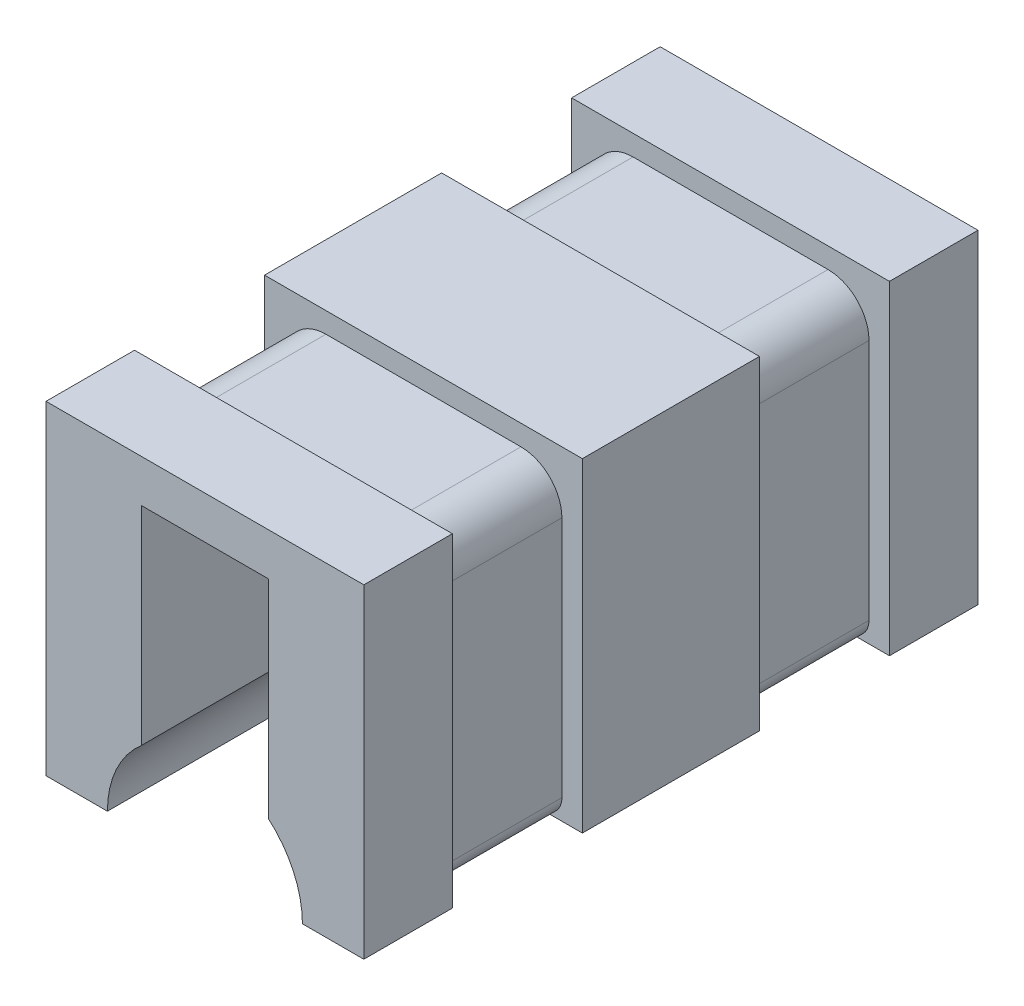
ISO-10303-21;
HEADER;
FILE_DESCRIPTION(('STEP AP214'),'2;1');
FILE_NAME('part.step','',(''),(''),'','','');
FILE_SCHEMA(('AUTOMOTIVE_DESIGN { 1 0 10303 214 1 1 1 1 }'));
ENDSEC;
DATA;
#1=APPLICATION_CONTEXT('core data for automotive mechanical design processes');
#2=APPLICATION_PROTOCOL_DEFINITION('international standard','automotive_design',2000,#1);
#3=PRODUCT_CONTEXT('',#1,'mechanical');
#4=PRODUCT('Part','Part','',(#3));
#5=PRODUCT_RELATED_PRODUCT_CATEGORY('part','',(#4));
#6=PRODUCT_DEFINITION_FORMATION('','',#4);
#7=PRODUCT_DEFINITION_CONTEXT('part definition',#1,'design');
#8=PRODUCT_DEFINITION('design','',#6,#7);
#9=PRODUCT_DEFINITION_SHAPE('','',#8);
#10=(LENGTH_UNIT() NAMED_UNIT(*) SI_UNIT(.MILLI.,.METRE.));
#11=(NAMED_UNIT(*) PLANE_ANGLE_UNIT() SI_UNIT($,.RADIAN.));
#12=(NAMED_UNIT(*) SI_UNIT($,.STERADIAN.) SOLID_ANGLE_UNIT());
#13=UNCERTAINTY_MEASURE_WITH_UNIT(LENGTH_MEASURE(1.E-05),#10,'distance_accuracy_value','');
#14=(GEOMETRIC_REPRESENTATION_CONTEXT(3) GLOBAL_UNCERTAINTY_ASSIGNED_CONTEXT((#13)) GLOBAL_UNIT_ASSIGNED_CONTEXT((#10,
#11,#12)) REPRESENTATION_CONTEXT('',''));
#15=CARTESIAN_POINT('',(0.,0.,0.));
#16=DIRECTION('',(0.,0.,1.));
#17=DIRECTION('',(1.,0.,0.));
#18=AXIS2_PLACEMENT_3D('',#15,#16,#17);
#19=CARTESIAN_POINT('',(-7.7625,15.8405273700718,15.));
#20=DIRECTION('',(0.,-1.,0.));
#21=DIRECTION('',(0.,0.,-1.));
#22=AXIS2_PLACEMENT_3D('',#19,#20,#21);
#23=PLANE('',#22);
#24=DIRECTION('',(0.,0.,-1.));
#25=VECTOR('',#24,1.);
#26=CARTESIAN_POINT('',(7.7625,15.8405273700718,15.));
#27=LINE('',#26,#25);
#28=CARTESIAN_POINT('',(7.7625,15.8405273700718,4.325));
#29=VERTEX_POINT('',#28);
#30=CARTESIAN_POINT('',(7.7625,15.8405273700718,-4.325));
#31=VERTEX_POINT('',#30);
#32=EDGE_CURVE('E271',#29,#31,#27,.T.);
#33=ORIENTED_EDGE('',*,*,#32,.T.);
#34=DIRECTION('',(-1.,0.,0.));
#35=VECTOR('',#34,1.);
#36=CARTESIAN_POINT('',(0.,15.8405273700718,-4.325));
#37=LINE('',#36,#35);
#38=CARTESIAN_POINT('',(-7.7625,15.8405273700718,-4.325));
#39=VERTEX_POINT('',#38);
#40=EDGE_CURVE('E252',#31,#39,#37,.T.);
#41=ORIENTED_EDGE('',*,*,#40,.T.);
#42=DIRECTION('',(0.,0.,-1.));
#43=VECTOR('',#42,1.);
#44=CARTESIAN_POINT('',(-7.7625,15.8405273700718,15.));
#45=LINE('',#44,#43);
#46=CARTESIAN_POINT('',(-7.7625,15.8405273700718,4.325));
#47=VERTEX_POINT('',#46);
#48=EDGE_CURVE('E461',#47,#39,#45,.T.);
#49=ORIENTED_EDGE('',*,*,#48,.F.);
#50=DIRECTION('',(-1.,0.,0.));
#51=VECTOR('',#50,1.);
#52=CARTESIAN_POINT('',(0.,15.8405273700718,4.325));
#53=LINE('',#52,#51);
#54=EDGE_CURVE('E277',#29,#47,#53,.T.);
#55=ORIENTED_EDGE('',*,*,#54,.F.);
#56=EDGE_LOOP('',(#33,#41,#49,#55));
#57=FACE_BOUND('',#56,.T.);
#58=ADVANCED_FACE('F33',(#57),#23,.F.);
#59=CARTESIAN_POINT('',(4.7625,0.,15.));
#60=DIRECTION('',(0.,1.,0.));
#61=DIRECTION('',(0.,0.,1.));
#62=AXIS2_PLACEMENT_3D('',#59,#60,#61);
#63=PLANE('',#62);
#64=DIRECTION('',(-1.,0.,0.));
#65=VECTOR('',#64,1.);
#66=CARTESIAN_POINT('',(7.7625,0.,-10.675));
#67=LINE('',#66,#65);
#68=CARTESIAN_POINT('',(7.7625,0.,-10.675));
#69=VERTEX_POINT('',#68);
#70=CARTESIAN_POINT('',(5.7625,0.,-10.675));
#71=VERTEX_POINT('',#70);
#72=EDGE_CURVE('E533',#69,#71,#67,.T.);
#73=ORIENTED_EDGE('',*,*,#72,.T.);
#74=DIRECTION('',(0.,0.,-1.));
#75=VECTOR('',#74,1.);
#76=CARTESIAN_POINT('',(5.7625,0.,15.));
#77=LINE('',#76,#75);
#78=CARTESIAN_POINT('',(5.7625,0.,-4.325));
#79=VERTEX_POINT('',#78);
#80=EDGE_CURVE('E362',#71,#79,#77,.F.);
#81=ORIENTED_EDGE('',*,*,#80,.T.);
#82=DIRECTION('',(-1.,0.,0.));
#83=VECTOR('',#82,1.);
#84=CARTESIAN_POINT('',(7.7625,0.,-4.325));
#85=LINE('',#84,#83);
#86=CARTESIAN_POINT('',(7.7625,0.,-4.325));
#87=VERTEX_POINT('',#86);
#88=EDGE_CURVE('E274',#87,#79,#85,.T.);
#89=ORIENTED_EDGE('',*,*,#88,.F.);
#90=DIRECTION('',(0.,0.,-1.));
#91=VECTOR('',#90,1.);
#92=CARTESIAN_POINT('',(7.7625,0.,15.));
#93=LINE('',#92,#91);
#94=CARTESIAN_POINT('',(7.7625,0.,4.325));
#95=VERTEX_POINT('',#94);
#96=EDGE_CURVE('E273',#95,#87,#93,.T.);
#97=ORIENTED_EDGE('',*,*,#96,.F.);
#98=DIRECTION('',(-1.,0.,0.));
#99=VECTOR('',#98,1.);
#100=CARTESIAN_POINT('',(7.7625,0.,4.325));
#101=LINE('',#100,#99);
#102=CARTESIAN_POINT('',(5.7625,0.,4.325));
#103=VERTEX_POINT('',#102);
#104=EDGE_CURVE('E495',#95,#103,#101,.T.);
#105=ORIENTED_EDGE('',*,*,#104,.T.);
#106=DIRECTION('',(0.,0.,1.));
#107=VECTOR('',#106,1.);
#108=CARTESIAN_POINT('',(5.7625,0.,10.675));
#109=LINE('',#108,#107);
#110=CARTESIAN_POINT('',(5.7625,0.,10.675));
#111=VERTEX_POINT('',#110);
#112=EDGE_CURVE('E359',#103,#111,#109,.T.);
#113=ORIENTED_EDGE('',*,*,#112,.T.);
#114=DIRECTION('',(-1.,0.,0.));
#115=VECTOR('',#114,1.);
#116=CARTESIAN_POINT('',(7.7625,0.,10.675));
#117=LINE('',#116,#115);
#118=CARTESIAN_POINT('',(7.7625,0.,10.675));
#119=VERTEX_POINT('',#118);
#120=EDGE_CURVE('E509',#119,#111,#117,.T.);
#121=ORIENTED_EDGE('',*,*,#120,.F.);
#122=CARTESIAN_POINT('',(7.7625,0.,15.));
#123=VERTEX_POINT('',#122);
#124=EDGE_CURVE('E288',#123,#119,#93,.T.);
#125=ORIENTED_EDGE('',*,*,#124,.F.);
#126=DIRECTION('',(1.,0.,0.));
#127=VECTOR('',#126,1.);
#128=CARTESIAN_POINT('',(4.7625,0.,15.));
#129=LINE('',#128,#127);
#130=CARTESIAN_POINT('',(4.7625,0.,15.));
#131=VERTEX_POINT('',#130);
#132=EDGE_CURVE('E421',#131,#123,#129,.T.);
#133=ORIENTED_EDGE('',*,*,#132,.F.);
#134=DIRECTION('',(0.,0.,-1.));
#135=VECTOR('',#134,1.);
#136=CARTESIAN_POINT('',(4.7625,0.,15.));
#137=LINE('',#136,#135);
#138=CARTESIAN_POINT('',(4.7625,0.,-15.));
#139=VERTEX_POINT('',#138);
#140=EDGE_CURVE('E291',#131,#139,#137,.T.);
#141=ORIENTED_EDGE('',*,*,#140,.T.);
#142=DIRECTION('',(1.,0.,0.));
#143=VECTOR('',#142,1.);
#144=CARTESIAN_POINT('',(4.7625,0.,-15.));
#145=LINE('',#144,#143);
#146=CARTESIAN_POINT('',(7.7625,0.,-15.));
#147=VERTEX_POINT('',#146);
#148=EDGE_CURVE('E444',#139,#147,#145,.T.);
#149=ORIENTED_EDGE('',*,*,#148,.T.);
#150=EDGE_CURVE('E283',#69,#147,#93,.T.);
#151=ORIENTED_EDGE('',*,*,#150,.F.);
#152=EDGE_LOOP('',(#73,#81,#89,#97,#105,#113,#121,#125,#133,#141,#149,#151));
#153=FACE_BOUND('',#152,.T.);
#154=ADVANCED_FACE('F543',(#153),#63,.F.);
#155=CARTESIAN_POINT('',(7.7625,0.,15.));
#156=DIRECTION('',(-1.,0.,0.));
#157=DIRECTION('',(0.,-1.,0.));
#158=AXIS2_PLACEMENT_3D('',#155,#156,#157);
#159=PLANE('',#158);
#160=DIRECTION('',(0.,-1.,0.));
#161=VECTOR('',#160,1.);
#162=CARTESIAN_POINT('',(7.7625,15.8405273700718,-4.325));
#163=LINE('',#162,#161);
#164=EDGE_CURVE('E255',#31,#87,#163,.T.);
#165=ORIENTED_EDGE('',*,*,#164,.F.);
#166=ORIENTED_EDGE('',*,*,#32,.F.);
#167=DIRECTION('',(0.,-1.,0.));
#168=VECTOR('',#167,1.);
#169=CARTESIAN_POINT('',(7.7625,15.8405273700718,4.325));
#170=LINE('',#169,#168);
#171=EDGE_CURVE('E494',#29,#95,#170,.T.);
#172=ORIENTED_EDGE('',*,*,#171,.T.);
#173=ORIENTED_EDGE('',*,*,#96,.T.);
#174=EDGE_LOOP('',(#165,#166,#172,#173));
#175=FACE_BOUND('',#174,.T.);
#176=ADVANCED_FACE('F269',(#175),#159,.F.);
#177=DIRECTION('',(-1.,0.,0.));
#178=VECTOR('',#177,1.);
#179=CARTESIAN_POINT('',(0.,15.8405273700718,-10.675));
#180=LINE('',#179,#178);
#181=CARTESIAN_POINT('',(7.7625,15.8405273700718,-10.675));
#182=VERTEX_POINT('',#181);
#183=CARTESIAN_POINT('',(-7.7625,15.8405273700718,-10.675));
#184=VERTEX_POINT('',#183);
#185=EDGE_CURVE('E522',#182,#184,#180,.T.);
#186=ORIENTED_EDGE('',*,*,#185,.F.);
#187=CARTESIAN_POINT('',(7.7625,15.8405273700718,-15.));
#188=VERTEX_POINT('',#187);
#189=EDGE_CURVE('E280',#182,#188,#27,.T.);
#190=ORIENTED_EDGE('',*,*,#189,.T.);
#191=DIRECTION('',(-1.,0.,0.));
#192=VECTOR('',#191,1.);
#193=CARTESIAN_POINT('',(-7.7625,15.8405273700718,-15.));
#194=LINE('',#193,#192);
#195=CARTESIAN_POINT('',(-7.7625,15.8405273700718,-15.));
#196=VERTEX_POINT('',#195);
#197=EDGE_CURVE('E450',#188,#196,#194,.T.);
#198=ORIENTED_EDGE('',*,*,#197,.T.);
#199=EDGE_CURVE('E459',#184,#196,#45,.T.);
#200=ORIENTED_EDGE('',*,*,#199,.F.);
#201=EDGE_LOOP('',(#186,#190,#198,#200));
#202=FACE_BOUND('',#201,.T.);
#203=ADVANCED_FACE('F590',(#202),#23,.F.);
#204=CARTESIAN_POINT('',(-7.7625,15.8405273700718,15.));
#205=DIRECTION('',(1.,0.,0.));
#206=DIRECTION('',(0.,1.,0.));
#207=AXIS2_PLACEMENT_3D('',#204,#205,#206);
#208=PLANE('',#207);
#209=DIRECTION('',(0.,-1.,0.));
#210=VECTOR('',#209,1.);
#211=CARTESIAN_POINT('',(-7.7625,15.8405273700718,-4.325));
#212=LINE('',#211,#210);
#213=CARTESIAN_POINT('',(-7.7625,0.,-4.325));
#214=VERTEX_POINT('',#213);
#215=EDGE_CURVE('E258',#39,#214,#212,.T.);
#216=ORIENTED_EDGE('',*,*,#215,.T.);
#217=DIRECTION('',(0.,0.,-1.));
#218=VECTOR('',#217,1.);
#219=CARTESIAN_POINT('',(-7.7625,0.,15.));
#220=LINE('',#219,#218);
#221=CARTESIAN_POINT('',(-7.7625,0.,4.325));
#222=VERTEX_POINT('',#221);
#223=EDGE_CURVE('E460',#222,#214,#220,.T.);
#224=ORIENTED_EDGE('',*,*,#223,.F.);
#225=DIRECTION('',(0.,-1.,0.));
#226=VECTOR('',#225,1.);
#227=CARTESIAN_POINT('',(-7.7625,15.8405273700718,4.325));
#228=LINE('',#227,#226);
#229=EDGE_CURVE('E503',#47,#222,#228,.T.);
#230=ORIENTED_EDGE('',*,*,#229,.F.);
#231=ORIENTED_EDGE('',*,*,#48,.T.);
#232=EDGE_LOOP('',(#216,#224,#230,#231));
#233=FACE_BOUND('',#232,.T.);
#234=ADVANCED_FACE('F577',(#233),#208,.F.);
#235=CARTESIAN_POINT('',(-7.7625,0.,15.));
#236=DIRECTION('',(0.,1.,0.));
#237=DIRECTION('',(0.,0.,1.));
#238=AXIS2_PLACEMENT_3D('',#235,#236,#237);
#239=PLANE('',#238);
#240=DIRECTION('',(0.,0.,-1.));
#241=VECTOR('',#240,1.);
#242=CARTESIAN_POINT('',(-5.7625,0.,-10.675));
#243=LINE('',#242,#241);
#244=CARTESIAN_POINT('',(-5.7625,0.,-4.325));
#245=VERTEX_POINT('',#244);
#246=CARTESIAN_POINT('',(-5.7625,0.,-10.675));
#247=VERTEX_POINT('',#246);
#248=EDGE_CURVE('E351',#245,#247,#243,.T.);
#249=ORIENTED_EDGE('',*,*,#248,.T.);
#250=DIRECTION('',(1.,0.,0.));
#251=VECTOR('',#250,1.);
#252=CARTESIAN_POINT('',(-7.7625,0.,-10.675));
#253=LINE('',#252,#251);
#254=CARTESIAN_POINT('',(-7.7625,0.,-10.675));
#255=VERTEX_POINT('',#254);
#256=EDGE_CURVE('E466',#255,#247,#253,.T.);
#257=ORIENTED_EDGE('',*,*,#256,.F.);
#258=CARTESIAN_POINT('',(-7.7625,0.,-15.));
#259=VERTEX_POINT('',#258);
#260=EDGE_CURVE('E458',#255,#259,#220,.T.);
#261=ORIENTED_EDGE('',*,*,#260,.T.);
#262=DIRECTION('',(1.,0.,0.));
#263=VECTOR('',#262,1.);
#264=CARTESIAN_POINT('',(-7.7625,0.,-15.));
#265=LINE('',#264,#263);
#266=CARTESIAN_POINT('',(-4.7625,0.,-15.));
#267=VERTEX_POINT('',#266);
#268=EDGE_CURVE('E413',#259,#267,#265,.T.);
#269=ORIENTED_EDGE('',*,*,#268,.T.);
#270=DIRECTION('',(0.,0.,-1.));
#271=VECTOR('',#270,1.);
#272=CARTESIAN_POINT('',(-4.7625,0.,15.));
#273=LINE('',#272,#271);
#274=CARTESIAN_POINT('',(-4.7625,0.,15.));
#275=VERTEX_POINT('',#274);
#276=EDGE_CURVE('E431',#275,#267,#273,.T.);
#277=ORIENTED_EDGE('',*,*,#276,.F.);
#278=DIRECTION('',(1.,0.,0.));
#279=VECTOR('',#278,1.);
#280=CARTESIAN_POINT('',(-7.7625,0.,15.));
#281=LINE('',#280,#279);
#282=CARTESIAN_POINT('',(-7.7625,0.,15.));
#283=VERTEX_POINT('',#282);
#284=EDGE_CURVE('E429',#283,#275,#281,.T.);
#285=ORIENTED_EDGE('',*,*,#284,.F.);
#286=CARTESIAN_POINT('',(-7.7625,0.,10.675));
#287=VERTEX_POINT('',#286);
#288=EDGE_CURVE('E398',#283,#287,#220,.T.);
#289=ORIENTED_EDGE('',*,*,#288,.T.);
#290=DIRECTION('',(1.,0.,0.));
#291=VECTOR('',#290,1.);
#292=CARTESIAN_POINT('',(-7.7625,0.,10.675));
#293=LINE('',#292,#291);
#294=CARTESIAN_POINT('',(-5.7625,0.,10.675));
#295=VERTEX_POINT('',#294);
#296=EDGE_CURVE('E386',#287,#295,#293,.T.);
#297=ORIENTED_EDGE('',*,*,#296,.T.);
#298=DIRECTION('',(0.,0.,1.));
#299=VECTOR('',#298,1.);
#300=CARTESIAN_POINT('',(-5.7625,0.,15.));
#301=LINE('',#300,#299);
#302=CARTESIAN_POINT('',(-5.7625,0.,4.325));
#303=VERTEX_POINT('',#302);
#304=EDGE_CURVE('E348',#295,#303,#301,.F.);
#305=ORIENTED_EDGE('',*,*,#304,.T.);
#306=DIRECTION('',(1.,0.,0.));
#307=VECTOR('',#306,1.);
#308=CARTESIAN_POINT('',(-7.7625,0.,4.325));
#309=LINE('',#308,#307);
#310=EDGE_CURVE('E393',#222,#303,#309,.T.);
#311=ORIENTED_EDGE('',*,*,#310,.F.);
#312=ORIENTED_EDGE('',*,*,#223,.T.);
#313=DIRECTION('',(1.,0.,0.));
#314=VECTOR('',#313,1.);
#315=CARTESIAN_POINT('',(-7.7625,0.,-4.325));
#316=LINE('',#315,#314);
#317=EDGE_CURVE('E526',#214,#245,#316,.T.);
#318=ORIENTED_EDGE('',*,*,#317,.T.);
#319=EDGE_LOOP('',(#249,#257,#261,#269,#277,#285,#289,#297,#305,#311,#312,#318));
#320=FACE_BOUND('',#319,.T.);
#321=ADVANCED_FACE('F391',(#320),#239,.F.);
#322=ORIENTED_EDGE('',*,*,#189,.F.);
#323=DIRECTION('',(0.,-1.,0.));
#324=VECTOR('',#323,1.);
#325=CARTESIAN_POINT('',(7.7625,15.8405273700718,-10.675));
#326=LINE('',#325,#324);
#327=EDGE_CURVE('E535',#182,#69,#326,.T.);
#328=ORIENTED_EDGE('',*,*,#327,.T.);
#329=ORIENTED_EDGE('',*,*,#150,.T.);
#330=DIRECTION('',(0.,1.,0.));
#331=VECTOR('',#330,1.);
#332=CARTESIAN_POINT('',(7.7625,0.,-15.));
#333=LINE('',#332,#331);
#334=EDGE_CURVE('E447',#147,#188,#333,.T.);
#335=ORIENTED_EDGE('',*,*,#334,.T.);
#336=EDGE_LOOP('',(#322,#328,#329,#335));
#337=FACE_BOUND('',#336,.T.);
#338=ADVANCED_FACE('F582',(#337),#159,.F.);
#339=CARTESIAN_POINT('',(7.7625,15.8405273700718,15.));
#340=VERTEX_POINT('',#339);
#341=CARTESIAN_POINT('',(7.7625,15.8405273700718,10.675));
#342=VERTEX_POINT('',#341);
#343=EDGE_CURVE('E279',#340,#342,#27,.T.);
#344=ORIENTED_EDGE('',*,*,#343,.T.);
#345=DIRECTION('',(-1.,0.,0.));
#346=VECTOR('',#345,1.);
#347=CARTESIAN_POINT('',(0.,15.8405273700718,10.675));
#348=LINE('',#347,#346);
#349=CARTESIAN_POINT('',(-7.7625,15.8405273700718,10.675));
#350=VERTEX_POINT('',#349);
#351=EDGE_CURVE('E403',#342,#350,#348,.T.);
#352=ORIENTED_EDGE('',*,*,#351,.T.);
#353=CARTESIAN_POINT('',(-7.7625,15.8405273700718,15.));
#354=VERTEX_POINT('',#353);
#355=EDGE_CURVE('E284',#354,#350,#45,.T.);
#356=ORIENTED_EDGE('',*,*,#355,.F.);
#357=DIRECTION('',(-1.,0.,0.));
#358=VECTOR('',#357,1.);
#359=CARTESIAN_POINT('',(-7.7625,15.8405273700718,15.));
#360=LINE('',#359,#358);
#361=EDGE_CURVE('E425',#340,#354,#360,.T.);
#362=ORIENTED_EDGE('',*,*,#361,.F.);
#363=EDGE_LOOP('',(#344,#352,#356,#362));
#364=FACE_BOUND('',#363,.T.);
#365=ADVANCED_FACE('F492',(#364),#23,.F.);
#366=ORIENTED_EDGE('',*,*,#260,.F.);
#367=DIRECTION('',(0.,-1.,0.));
#368=VECTOR('',#367,1.);
#369=CARTESIAN_POINT('',(-7.7625,15.8405273700718,-10.675));
#370=LINE('',#369,#368);
#371=EDGE_CURVE('E264',#184,#255,#370,.T.);
#372=ORIENTED_EDGE('',*,*,#371,.F.);
#373=ORIENTED_EDGE('',*,*,#199,.T.);
#374=DIRECTION('',(0.,-1.,0.));
#375=VECTOR('',#374,1.);
#376=CARTESIAN_POINT('',(-7.7625,15.8405273700718,-15.));
#377=LINE('',#376,#375);
#378=EDGE_CURVE('E453',#196,#259,#377,.T.);
#379=ORIENTED_EDGE('',*,*,#378,.T.);
#380=EDGE_LOOP('',(#366,#372,#373,#379));
#381=FACE_BOUND('',#380,.T.);
#382=ADVANCED_FACE('F470',(#381),#208,.F.);
#383=CARTESIAN_POINT('',(0.,0.,15.));
#384=DIRECTION('',(0.,0.,-1.));
#385=DIRECTION('',(-1.,0.,0.));
#386=AXIS2_PLACEMENT_3D('',#383,#384,#385);
#387=CYLINDRICAL_SURFACE('',#386,4.7625);
#388=CARTESIAN_POINT('',(0.,0.,-15.));
#389=DIRECTION('',(0.,0.,-1.));
#390=DIRECTION('',(1.,0.,0.));
#391=AXIS2_PLACEMENT_3D('',#388,#389,#390);
#392=CIRCLE('',#391,4.7625);
#393=CARTESIAN_POINT('',(-3.1,3.61543998014073,-15.));
#394=VERTEX_POINT('',#393);
#395=EDGE_CURVE('E432',#267,#394,#392,.T.);
#396=ORIENTED_EDGE('',*,*,#395,.T.);
#397=DIRECTION('',(0.,0.,-1.));
#398=VECTOR('',#397,1.);
#399=CARTESIAN_POINT('',(-3.1,3.61543998014073,15.));
#400=LINE('',#399,#398);
#401=CARTESIAN_POINT('',(-3.1,3.61543998014073,15.));
#402=VERTEX_POINT('',#401);
#403=EDGE_CURVE('E303',#402,#394,#400,.T.);
#404=ORIENTED_EDGE('',*,*,#403,.F.);
#405=CARTESIAN_POINT('',(0.,0.,15.));
#406=DIRECTION('',(0.,0.,-1.));
#407=DIRECTION('',(1.,0.,0.));
#408=AXIS2_PLACEMENT_3D('',#405,#406,#407);
#409=CIRCLE('',#408,4.7625);
#410=EDGE_CURVE('E409',#275,#402,#409,.T.);
#411=ORIENTED_EDGE('',*,*,#410,.F.);
#412=ORIENTED_EDGE('',*,*,#276,.T.);
#413=EDGE_LOOP('',(#396,#404,#411,#412));
#414=FACE_BOUND('',#413,.T.);
#415=ADVANCED_FACE('F479',(#414),#387,.F.);
#416=CARTESIAN_POINT('',(-3.1,3.61543998014073,15.));
#417=DIRECTION('',(-1.,0.,0.));
#418=DIRECTION('',(0.,-1.,0.));
#419=AXIS2_PLACEMENT_3D('',#416,#417,#418);
#420=PLANE('',#419);
#421=DIRECTION('',(0.,1.,0.));
#422=VECTOR('',#421,1.);
#423=CARTESIAN_POINT('',(-3.1,3.61543998014073,-15.));
#424=LINE('',#423,#422);
#425=CARTESIAN_POINT('',(-3.1,13.7625,-15.));
#426=VERTEX_POINT('',#425);
#427=EDGE_CURVE('E435',#394,#426,#424,.T.);
#428=ORIENTED_EDGE('',*,*,#427,.T.);
#429=DIRECTION('',(0.,0.,-1.));
#430=VECTOR('',#429,1.);
#431=CARTESIAN_POINT('',(-3.1,13.7625,15.));
#432=LINE('',#431,#430);
#433=CARTESIAN_POINT('',(-3.1,13.7625,15.));
#434=VERTEX_POINT('',#433);
#435=EDGE_CURVE('E300',#434,#426,#432,.T.);
#436=ORIENTED_EDGE('',*,*,#435,.F.);
#437=DIRECTION('',(0.,1.,0.));
#438=VECTOR('',#437,1.);
#439=CARTESIAN_POINT('',(-3.1,3.61543998014073,15.));
#440=LINE('',#439,#438);
#441=EDGE_CURVE('E412',#402,#434,#440,.T.);
#442=ORIENTED_EDGE('',*,*,#441,.F.);
#443=ORIENTED_EDGE('',*,*,#403,.T.);
#444=EDGE_LOOP('',(#428,#436,#442,#443));
#445=FACE_BOUND('',#444,.T.);
#446=ADVANCED_FACE('F770',(#445),#420,.F.);
#447=CARTESIAN_POINT('',(-3.1,13.7625,15.));
#448=DIRECTION('',(0.,1.,0.));
#449=DIRECTION('',(0.,0.,1.));
#450=AXIS2_PLACEMENT_3D('',#447,#448,#449);
#451=PLANE('',#450);
#452=DIRECTION('',(1.,0.,0.));
#453=VECTOR('',#452,1.);
#454=CARTESIAN_POINT('',(-3.1,13.7625,-15.));
#455=LINE('',#454,#453);
#456=CARTESIAN_POINT('',(3.1,13.7625,-15.));
#457=VERTEX_POINT('',#456);
#458=EDGE_CURVE('E438',#426,#457,#455,.T.);
#459=ORIENTED_EDGE('',*,*,#458,.T.);
#460=DIRECTION('',(0.,0.,-1.));
#461=VECTOR('',#460,1.);
#462=CARTESIAN_POINT('',(3.1,13.7625,15.));
#463=LINE('',#462,#461);
#464=CARTESIAN_POINT('',(3.1,13.7625,15.));
#465=VERTEX_POINT('',#464);
#466=EDGE_CURVE('E297',#465,#457,#463,.T.);
#467=ORIENTED_EDGE('',*,*,#466,.F.);
#468=DIRECTION('',(1.,0.,0.));
#469=VECTOR('',#468,1.);
#470=CARTESIAN_POINT('',(-3.1,13.7625,15.));
#471=LINE('',#470,#469);
#472=EDGE_CURVE('E415',#434,#465,#471,.T.);
#473=ORIENTED_EDGE('',*,*,#472,.F.);
#474=ORIENTED_EDGE('',*,*,#435,.T.);
#475=EDGE_LOOP('',(#459,#467,#473,#474));
#476=FACE_BOUND('',#475,.T.);
#477=ADVANCED_FACE('F773',(#476),#451,.F.);
#478=CARTESIAN_POINT('',(3.1,3.61543998014073,15.));
#479=DIRECTION('',(1.,0.,0.));
#480=DIRECTION('',(0.,1.,0.));
#481=AXIS2_PLACEMENT_3D('',#478,#479,#480);
#482=PLANE('',#481);
#483=DIRECTION('',(0.,-1.,0.));
#484=VECTOR('',#483,1.);
#485=CARTESIAN_POINT('',(3.1,3.61543998014073,-15.));
#486=LINE('',#485,#484);
#487=CARTESIAN_POINT('',(3.1,3.61543998014073,-15.));
#488=VERTEX_POINT('',#487);
#489=EDGE_CURVE('E440',#457,#488,#486,.T.);
#490=ORIENTED_EDGE('',*,*,#489,.T.);
#491=DIRECTION('',(0.,0.,-1.));
#492=VECTOR('',#491,1.);
#493=CARTESIAN_POINT('',(3.1,3.61543998014073,15.));
#494=LINE('',#493,#492);
#495=CARTESIAN_POINT('',(3.1,3.61543998014073,15.));
#496=VERTEX_POINT('',#495);
#497=EDGE_CURVE('E294',#496,#488,#494,.T.);
#498=ORIENTED_EDGE('',*,*,#497,.F.);
#499=DIRECTION('',(0.,-1.,0.));
#500=VECTOR('',#499,1.);
#501=CARTESIAN_POINT('',(3.1,3.61543998014073,15.));
#502=LINE('',#501,#500);
#503=EDGE_CURVE('E417',#465,#496,#502,.T.);
#504=ORIENTED_EDGE('',*,*,#503,.F.);
#505=ORIENTED_EDGE('',*,*,#466,.T.);
#506=EDGE_LOOP('',(#490,#498,#504,#505));
#507=FACE_BOUND('',#506,.T.);
#508=ADVANCED_FACE('F777',(#507),#482,.F.);
#509=CARTESIAN_POINT('',(0.,0.,15.));
#510=DIRECTION('',(0.,0.,-1.));
#511=DIRECTION('',(-1.,0.,0.));
#512=AXIS2_PLACEMENT_3D('',#509,#510,#511);
#513=CYLINDRICAL_SURFACE('',#512,4.7625);
#514=CARTESIAN_POINT('',(0.,0.,-15.));
#515=DIRECTION('',(0.,0.,-1.));
#516=DIRECTION('',(1.,0.,0.));
#517=AXIS2_PLACEMENT_3D('',#514,#515,#516);
#518=CIRCLE('',#517,4.7625);
#519=EDGE_CURVE('E442',#488,#139,#518,.T.);
#520=ORIENTED_EDGE('',*,*,#519,.T.);
#521=ORIENTED_EDGE('',*,*,#140,.F.);
#522=CARTESIAN_POINT('',(0.,0.,15.));
#523=DIRECTION('',(0.,0.,-1.));
#524=DIRECTION('',(1.,0.,0.));
#525=AXIS2_PLACEMENT_3D('',#522,#523,#524);
#526=CIRCLE('',#525,4.7625);
#527=EDGE_CURVE('E419',#496,#131,#526,.T.);
#528=ORIENTED_EDGE('',*,*,#527,.F.);
#529=ORIENTED_EDGE('',*,*,#497,.T.);
#530=EDGE_LOOP('',(#520,#521,#528,#529));
#531=FACE_BOUND('',#530,.T.);
#532=ADVANCED_FACE('F624',(#531),#513,.F.);
#533=ORIENTED_EDGE('',*,*,#124,.T.);
#534=DIRECTION('',(0.,-1.,0.));
#535=VECTOR('',#534,1.);
#536=CARTESIAN_POINT('',(7.7625,15.8405273700718,10.675));
#537=LINE('',#536,#535);
#538=EDGE_CURVE('E506',#342,#119,#537,.T.);
#539=ORIENTED_EDGE('',*,*,#538,.F.);
#540=ORIENTED_EDGE('',*,*,#343,.F.);
#541=DIRECTION('',(0.,1.,0.));
#542=VECTOR('',#541,1.);
#543=CARTESIAN_POINT('',(7.7625,0.,15.));
#544=LINE('',#543,#542);
#545=EDGE_CURVE('E423',#123,#340,#544,.T.);
#546=ORIENTED_EDGE('',*,*,#545,.F.);
#547=EDGE_LOOP('',(#533,#539,#540,#546));
#548=FACE_BOUND('',#547,.T.);
#549=ADVANCED_FACE('F618',(#548),#159,.F.);
#550=ORIENTED_EDGE('',*,*,#355,.T.);
#551=DIRECTION('',(0.,-1.,0.));
#552=VECTOR('',#551,1.);
#553=CARTESIAN_POINT('',(-7.7625,15.8405273700718,10.675));
#554=LINE('',#553,#552);
#555=EDGE_CURVE('E399',#350,#287,#554,.T.);
#556=ORIENTED_EDGE('',*,*,#555,.T.);
#557=ORIENTED_EDGE('',*,*,#288,.F.);
#558=DIRECTION('',(0.,-1.,0.));
#559=VECTOR('',#558,1.);
#560=CARTESIAN_POINT('',(-7.7625,15.8405273700718,15.));
#561=LINE('',#560,#559);
#562=EDGE_CURVE('E427',#354,#283,#561,.T.);
#563=ORIENTED_EDGE('',*,*,#562,.F.);
#564=EDGE_LOOP('',(#550,#556,#557,#563));
#565=FACE_BOUND('',#564,.T.);
#566=ADVANCED_FACE('F488',(#565),#208,.F.);
#567=CARTESIAN_POINT('',(0.,0.,15.));
#568=DIRECTION('',(0.,0.,1.));
#569=DIRECTION('',(1.,0.,0.));
#570=AXIS2_PLACEMENT_3D('',#567,#568,#569);
#571=PLANE('',#570);
#572=ORIENTED_EDGE('',*,*,#410,.T.);
#573=ORIENTED_EDGE('',*,*,#441,.T.);
#574=ORIENTED_EDGE('',*,*,#472,.T.);
#575=ORIENTED_EDGE('',*,*,#503,.T.);
#576=ORIENTED_EDGE('',*,*,#527,.T.);
#577=ORIENTED_EDGE('',*,*,#132,.T.);
#578=ORIENTED_EDGE('',*,*,#545,.T.);
#579=ORIENTED_EDGE('',*,*,#361,.T.);
#580=ORIENTED_EDGE('',*,*,#562,.T.);
#581=ORIENTED_EDGE('',*,*,#284,.T.);
#582=EDGE_LOOP('',(#572,#573,#574,#575,#576,#577,#578,#579,#580,#581));
#583=FACE_BOUND('',#582,.T.);
#584=ADVANCED_FACE('F482',(#583),#571,.T.);
#585=CARTESIAN_POINT('',(0.,0.,-15.));
#586=DIRECTION('',(0.,0.,1.));
#587=DIRECTION('',(1.,0.,0.));
#588=AXIS2_PLACEMENT_3D('',#585,#586,#587);
#589=PLANE('',#588);
#590=ORIENTED_EDGE('',*,*,#395,.F.);
#591=ORIENTED_EDGE('',*,*,#268,.F.);
#592=ORIENTED_EDGE('',*,*,#378,.F.);
#593=ORIENTED_EDGE('',*,*,#197,.F.);
#594=ORIENTED_EDGE('',*,*,#334,.F.);
#595=ORIENTED_EDGE('',*,*,#148,.F.);
#596=ORIENTED_EDGE('',*,*,#519,.F.);
#597=ORIENTED_EDGE('',*,*,#489,.F.);
#598=ORIENTED_EDGE('',*,*,#458,.F.);
#599=ORIENTED_EDGE('',*,*,#427,.F.);
#600=EDGE_LOOP('',(#590,#591,#592,#593,#594,#595,#596,#597,#598,#599));
#601=FACE_BOUND('',#600,.T.);
#602=ADVANCED_FACE('F475',(#601),#589,.F.);
#603=CARTESIAN_POINT('',(-6.7625,14.8405273700718,4.325));
#604=DIRECTION('',(0.,-1.,0.));
#605=DIRECTION('',(0.,0.,-1.));
#606=AXIS2_PLACEMENT_3D('',#603,#604,#605);
#607=PLANE('',#606);
#608=DIRECTION('',(1.,0.,0.));
#609=VECTOR('',#608,1.);
#610=CARTESIAN_POINT('',(-6.7625,14.8405273700718,10.675));
#611=LINE('',#610,#609);
#612=CARTESIAN_POINT('',(-4.7625,14.8405273700718,10.675));
#613=VERTEX_POINT('',#612);
#614=CARTESIAN_POINT('',(4.7625,14.8405273700718,10.675));
#615=VERTEX_POINT('',#614);
#616=EDGE_CURVE('E401',#613,#615,#611,.T.);
#617=ORIENTED_EDGE('',*,*,#616,.T.);
#618=DIRECTION('',(0.,0.,1.));
#619=VECTOR('',#618,1.);
#620=CARTESIAN_POINT('',(4.7625,14.8405273700718,4.325));
#621=LINE('',#620,#619);
#622=CARTESIAN_POINT('',(4.7625,14.8405273700718,4.325));
#623=VERTEX_POINT('',#622);
#624=EDGE_CURVE('E323',#615,#623,#621,.F.);
#625=ORIENTED_EDGE('',*,*,#624,.T.);
#626=DIRECTION('',(1.,0.,0.));
#627=VECTOR('',#626,1.);
#628=CARTESIAN_POINT('',(-6.7625,14.8405273700718,4.325));
#629=LINE('',#628,#627);
#630=CARTESIAN_POINT('',(-4.7625,14.8405273700718,4.325));
#631=VERTEX_POINT('',#630);
#632=EDGE_CURVE('E436',#631,#623,#629,.T.);
#633=ORIENTED_EDGE('',*,*,#632,.F.);
#634=DIRECTION('',(0.,0.,1.));
#635=VECTOR('',#634,1.);
#636=CARTESIAN_POINT('',(-4.7625,14.8405273700718,4.325));
#637=LINE('',#636,#635);
#638=EDGE_CURVE('E320',#631,#613,#637,.T.);
#639=ORIENTED_EDGE('',*,*,#638,.T.);
#640=EDGE_LOOP('',(#617,#625,#633,#639));
#641=FACE_BOUND('',#640,.T.);
#642=ADVANCED_FACE('F658',(#641),#607,.F.);
#643=CARTESIAN_POINT('',(-6.7625,0.,4.325));
#644=DIRECTION('',(1.,0.,0.));
#645=DIRECTION('',(0.,0.,-1.));
#646=AXIS2_PLACEMENT_3D('',#643,#644,#645);
#647=PLANE('',#646);
#648=DIRECTION('',(0.,1.,0.));
#649=VECTOR('',#648,1.);
#650=CARTESIAN_POINT('',(-6.7625,0.,4.325));
#651=LINE('',#650,#649);
#652=CARTESIAN_POINT('',(-6.7625,1.,4.325));
#653=VERTEX_POINT('',#652);
#654=CARTESIAN_POINT('',(-6.7625,12.8405273700718,4.325));
#655=VERTEX_POINT('',#654);
#656=EDGE_CURVE('E500',#653,#655,#651,.T.);
#657=ORIENTED_EDGE('',*,*,#656,.F.);
#658=DIRECTION('',(0.,0.,1.));
#659=VECTOR('',#658,1.);
#660=CARTESIAN_POINT('',(-6.7625,1.,4.325));
#661=LINE('',#660,#659);
#662=CARTESIAN_POINT('',(-6.7625,1.,10.675));
#663=VERTEX_POINT('',#662);
#664=EDGE_CURVE('E367',#653,#663,#661,.T.);
#665=ORIENTED_EDGE('',*,*,#664,.T.);
#666=DIRECTION('',(0.,1.,0.));
#667=VECTOR('',#666,1.);
#668=CARTESIAN_POINT('',(-6.7625,0.,10.675));
#669=LINE('',#668,#667);
#670=CARTESIAN_POINT('',(-6.7625,12.8405273700718,10.675));
#671=VERTEX_POINT('',#670);
#672=EDGE_CURVE('E388',#663,#671,#669,.T.);
#673=ORIENTED_EDGE('',*,*,#672,.T.);
#674=DIRECTION('',(0.,0.,1.));
#675=VECTOR('',#674,1.);
#676=CARTESIAN_POINT('',(-6.7625,12.8405273700718,4.325));
#677=LINE('',#676,#675);
#678=EDGE_CURVE('E325',#671,#655,#677,.F.);
#679=ORIENTED_EDGE('',*,*,#678,.T.);
#680=EDGE_LOOP('',(#657,#665,#673,#679));
#681=FACE_BOUND('',#680,.T.);
#682=ADVANCED_FACE('F653',(#681),#647,.F.);
#683=CARTESIAN_POINT('',(0.,0.,4.325));
#684=DIRECTION('',(0.,0.,1.));
#685=DIRECTION('',(1.,0.,0.));
#686=AXIS2_PLACEMENT_3D('',#683,#684,#685);
#687=PLANE('',#686);
#688=ORIENTED_EDGE('',*,*,#54,.T.);
#689=ORIENTED_EDGE('',*,*,#229,.T.);
#690=ORIENTED_EDGE('',*,*,#310,.T.);
#691=CARTESIAN_POINT('',(-5.7625,1.,4.325));
#692=DIRECTION('',(0.,0.,1.));
#693=DIRECTION('',(1.,0.,0.));
#694=AXIS2_PLACEMENT_3D('',#691,#692,#693);
#695=CIRCLE('',#694,1.);
#696=EDGE_CURVE('E11',#303,#653,#695,.F.);
#697=ORIENTED_EDGE('',*,*,#696,.T.);
#698=ORIENTED_EDGE('',*,*,#656,.T.);
#699=CARTESIAN_POINT('',(-4.7625,12.8405273700718,4.325));
#700=DIRECTION('',(0.,0.,1.));
#701=DIRECTION('',(1.,0.,0.));
#702=AXIS2_PLACEMENT_3D('',#699,#700,#701);
#703=CIRCLE('',#702,2.);
#704=EDGE_CURVE('E346',#655,#631,#703,.F.);
#705=ORIENTED_EDGE('',*,*,#704,.T.);
#706=ORIENTED_EDGE('',*,*,#632,.T.);
#707=CARTESIAN_POINT('',(4.7625,12.8405273700718,4.325));
#708=DIRECTION('',(0.,0.,1.));
#709=DIRECTION('',(1.,0.,0.));
#710=AXIS2_PLACEMENT_3D('',#707,#708,#709);
#711=CIRCLE('',#710,2.);
#712=CARTESIAN_POINT('',(6.7625,12.8405273700718,4.325));
#713=VERTEX_POINT('',#712);
#714=EDGE_CURVE('E340',#623,#713,#711,.F.);
#715=ORIENTED_EDGE('',*,*,#714,.T.);
#716=DIRECTION('',(0.,1.,0.));
#717=VECTOR('',#716,1.);
#718=CARTESIAN_POINT('',(6.7625,0.,4.325));
#719=LINE('',#718,#717);
#720=CARTESIAN_POINT('',(6.7625,1.,4.325));
#721=VERTEX_POINT('',#720);
#722=EDGE_CURVE('E508',#721,#713,#719,.T.);
#723=ORIENTED_EDGE('',*,*,#722,.F.);
#724=CARTESIAN_POINT('',(5.7625,1.,4.325));
#725=DIRECTION('',(0.,0.,1.));
#726=DIRECTION('',(1.,0.,0.));
#727=AXIS2_PLACEMENT_3D('',#724,#725,#726);
#728=CIRCLE('',#727,1.);
#729=EDGE_CURVE('E381',#721,#103,#728,.F.);
#730=ORIENTED_EDGE('',*,*,#729,.T.);
#731=ORIENTED_EDGE('',*,*,#104,.F.);
#732=ORIENTED_EDGE('',*,*,#171,.F.);
#733=EDGE_LOOP('',(#688,#689,#690,#697,#698,#705,#706,#715,#723,#730,#731,#732));
#734=FACE_BOUND('',#733,.T.);
#735=ADVANCED_FACE('F579',(#734),#687,.T.);
#736=CARTESIAN_POINT('',(0.,0.,10.675));
#737=DIRECTION('',(0.,0.,1.));
#738=DIRECTION('',(1.,0.,0.));
#739=AXIS2_PLACEMENT_3D('',#736,#737,#738);
#740=PLANE('',#739);
#741=ORIENTED_EDGE('',*,*,#351,.F.);
#742=ORIENTED_EDGE('',*,*,#538,.T.);
#743=ORIENTED_EDGE('',*,*,#120,.T.);
#744=CARTESIAN_POINT('',(5.7625,1.,10.675));
#745=DIRECTION('',(0.,0.,1.));
#746=DIRECTION('',(1.,0.,0.));
#747=AXIS2_PLACEMENT_3D('',#744,#745,#746);
#748=CIRCLE('',#747,1.);
#749=CARTESIAN_POINT('',(6.7625,1.,10.675));
#750=VERTEX_POINT('',#749);
#751=EDGE_CURVE('E379',#111,#750,#748,.T.);
#752=ORIENTED_EDGE('',*,*,#751,.T.);
#753=DIRECTION('',(0.,1.,0.));
#754=VECTOR('',#753,1.);
#755=CARTESIAN_POINT('',(6.7625,0.,10.675));
#756=LINE('',#755,#754);
#757=CARTESIAN_POINT('',(6.7625,12.8405273700718,10.675));
#758=VERTEX_POINT('',#757);
#759=EDGE_CURVE('E511',#750,#758,#756,.T.);
#760=ORIENTED_EDGE('',*,*,#759,.T.);
#761=CARTESIAN_POINT('',(4.7625,12.8405273700718,10.675));
#762=DIRECTION('',(0.,0.,1.));
#763=DIRECTION('',(1.,0.,0.));
#764=AXIS2_PLACEMENT_3D('',#761,#762,#763);
#765=CIRCLE('',#764,2.);
#766=EDGE_CURVE('E338',#758,#615,#765,.T.);
#767=ORIENTED_EDGE('',*,*,#766,.T.);
#768=ORIENTED_EDGE('',*,*,#616,.F.);
#769=CARTESIAN_POINT('',(-4.7625,12.8405273700718,10.675));
#770=DIRECTION('',(0.,0.,1.));
#771=DIRECTION('',(1.,0.,0.));
#772=AXIS2_PLACEMENT_3D('',#769,#770,#771);
#773=CIRCLE('',#772,2.);
#774=EDGE_CURVE('E343',#613,#671,#773,.T.);
#775=ORIENTED_EDGE('',*,*,#774,.T.);
#776=ORIENTED_EDGE('',*,*,#672,.F.);
#777=CARTESIAN_POINT('',(-5.7625,1.,10.675));
#778=DIRECTION('',(0.,0.,1.));
#779=DIRECTION('',(1.,0.,0.));
#780=AXIS2_PLACEMENT_3D('',#777,#778,#779);
#781=CIRCLE('',#780,1.);
#782=EDGE_CURVE('E41',#663,#295,#781,.T.);
#783=ORIENTED_EDGE('',*,*,#782,.T.);
#784=ORIENTED_EDGE('',*,*,#296,.F.);
#785=ORIENTED_EDGE('',*,*,#555,.F.);
#786=EDGE_LOOP('',(#741,#742,#743,#752,#760,#767,#768,#775,#776,#783,#784,#785));
#787=FACE_BOUND('',#786,.T.);
#788=ADVANCED_FACE('F385',(#787),#740,.F.);
#789=CARTESIAN_POINT('',(6.7625,0.,4.325));
#790=DIRECTION('',(1.,0.,0.));
#791=DIRECTION('',(0.,0.,-1.));
#792=AXIS2_PLACEMENT_3D('',#789,#790,#791);
#793=PLANE('',#792);
#794=ORIENTED_EDGE('',*,*,#759,.F.);
#795=DIRECTION('',(0.,0.,1.));
#796=VECTOR('',#795,1.);
#797=CARTESIAN_POINT('',(6.7625,1.,4.325));
#798=LINE('',#797,#796);
#799=EDGE_CURVE('E365',#750,#721,#798,.F.);
#800=ORIENTED_EDGE('',*,*,#799,.T.);
#801=ORIENTED_EDGE('',*,*,#722,.T.);
#802=DIRECTION('',(0.,0.,1.));
#803=VECTOR('',#802,1.);
#804=CARTESIAN_POINT('',(6.7625,12.8405273700718,10.675));
#805=LINE('',#804,#803);
#806=EDGE_CURVE('E317',#713,#758,#805,.T.);
#807=ORIENTED_EDGE('',*,*,#806,.T.);
#808=EDGE_LOOP('',(#794,#800,#801,#807));
#809=FACE_BOUND('',#808,.T.);
#810=ADVANCED_FACE('F594',(#809),#793,.T.);
#811=CARTESIAN_POINT('',(-6.7625,0.,-4.325));
#812=DIRECTION('',(-1.,0.,0.));
#813=DIRECTION('',(0.,0.,1.));
#814=AXIS2_PLACEMENT_3D('',#811,#812,#813);
#815=PLANE('',#814);
#816=DIRECTION('',(0.,1.,0.));
#817=VECTOR('',#816,1.);
#818=CARTESIAN_POINT('',(-6.7625,0.,-10.675));
#819=LINE('',#818,#817);
#820=CARTESIAN_POINT('',(-6.7625,1.,-10.675));
#821=VERTEX_POINT('',#820);
#822=CARTESIAN_POINT('',(-6.7625,12.8405273700718,-10.675));
#823=VERTEX_POINT('',#822);
#824=EDGE_CURVE('E517',#821,#823,#819,.T.);
#825=ORIENTED_EDGE('',*,*,#824,.F.);
#826=DIRECTION('',(0.,0.,-1.));
#827=VECTOR('',#826,1.);
#828=CARTESIAN_POINT('',(-6.7625,1.,-4.325));
#829=LINE('',#828,#827);
#830=CARTESIAN_POINT('',(-6.7625,1.,-4.325));
#831=VERTEX_POINT('',#830);
#832=EDGE_CURVE('E354',#821,#831,#829,.F.);
#833=ORIENTED_EDGE('',*,*,#832,.T.);
#834=DIRECTION('',(0.,1.,0.));
#835=VECTOR('',#834,1.);
#836=CARTESIAN_POINT('',(-6.7625,0.,-4.325));
#837=LINE('',#836,#835);
#838=CARTESIAN_POINT('',(-6.7625,12.8405273700718,-4.325));
#839=VERTEX_POINT('',#838);
#840=EDGE_CURVE('E528',#831,#839,#837,.T.);
#841=ORIENTED_EDGE('',*,*,#840,.T.);
#842=DIRECTION('',(0.,0.,-1.));
#843=VECTOR('',#842,1.);
#844=CARTESIAN_POINT('',(-6.7625,12.8405273700718,-4.325));
#845=LINE('',#844,#843);
#846=EDGE_CURVE('E306',#839,#823,#845,.T.);
#847=ORIENTED_EDGE('',*,*,#846,.T.);
#848=EDGE_LOOP('',(#825,#833,#841,#847));
#849=FACE_BOUND('',#848,.T.);
#850=ADVANCED_FACE('F592',(#849),#815,.T.);
#851=CARTESIAN_POINT('',(-6.7625,14.8405273700718,-4.325));
#852=DIRECTION('',(0.,1.,0.));
#853=DIRECTION('',(0.,0.,1.));
#854=AXIS2_PLACEMENT_3D('',#851,#852,#853);
#855=PLANE('',#854);
#856=DIRECTION('',(1.,0.,0.));
#857=VECTOR('',#856,1.);
#858=CARTESIAN_POINT('',(-6.7625,14.8405273700718,-10.675));
#859=LINE('',#858,#857);
#860=CARTESIAN_POINT('',(-4.7625,14.8405273700718,-10.675));
#861=VERTEX_POINT('',#860);
#862=CARTESIAN_POINT('',(4.7625,14.8405273700718,-10.675));
#863=VERTEX_POINT('',#862);
#864=EDGE_CURVE('E519',#861,#863,#859,.T.);
#865=ORIENTED_EDGE('',*,*,#864,.F.);
#866=DIRECTION('',(0.,0.,-1.));
#867=VECTOR('',#866,1.);
#868=CARTESIAN_POINT('',(-4.7625,14.8405273700718,-4.325));
#869=LINE('',#868,#867);
#870=CARTESIAN_POINT('',(-4.7625,14.8405273700718,-4.325));
#871=VERTEX_POINT('',#870);
#872=EDGE_CURVE('E312',#861,#871,#869,.F.);
#873=ORIENTED_EDGE('',*,*,#872,.T.);
#874=DIRECTION('',(1.,0.,0.));
#875=VECTOR('',#874,1.);
#876=CARTESIAN_POINT('',(-6.7625,14.8405273700718,-4.325));
#877=LINE('',#876,#875);
#878=CARTESIAN_POINT('',(4.7625,14.8405273700718,-4.325));
#879=VERTEX_POINT('',#878);
#880=EDGE_CURVE('E263',#871,#879,#877,.T.);
#881=ORIENTED_EDGE('',*,*,#880,.T.);
#882=DIRECTION('',(0.,0.,-1.));
#883=VECTOR('',#882,1.);
#884=CARTESIAN_POINT('',(4.7625,14.8405273700718,-10.675));
#885=LINE('',#884,#883);
#886=EDGE_CURVE('E309',#879,#863,#885,.T.);
#887=ORIENTED_EDGE('',*,*,#886,.T.);
#888=EDGE_LOOP('',(#865,#873,#881,#887));
#889=FACE_BOUND('',#888,.T.);
#890=ADVANCED_FACE('F562',(#889),#855,.T.);
#891=CARTESIAN_POINT('',(0.,0.,-4.325));
#892=DIRECTION('',(0.,0.,-1.));
#893=DIRECTION('',(1.,0.,0.));
#894=AXIS2_PLACEMENT_3D('',#891,#892,#893);
#895=PLANE('',#894);
#896=ORIENTED_EDGE('',*,*,#40,.F.);
#897=ORIENTED_EDGE('',*,*,#164,.T.);
#898=ORIENTED_EDGE('',*,*,#88,.T.);
#899=CARTESIAN_POINT('',(5.7625,1.,-4.325));
#900=DIRECTION('',(0.,0.,-1.));
#901=DIRECTION('',(-1.,0.,0.));
#902=AXIS2_PLACEMENT_3D('',#899,#900,#901);
#903=CIRCLE('',#902,1.);
#904=CARTESIAN_POINT('',(6.7625,1.,-4.325));
#905=VERTEX_POINT('',#904);
#906=EDGE_CURVE('E377',#79,#905,#903,.F.);
#907=ORIENTED_EDGE('',*,*,#906,.T.);
#908=DIRECTION('',(0.,1.,0.));
#909=VECTOR('',#908,1.);
#910=CARTESIAN_POINT('',(6.7625,0.,-4.325));
#911=LINE('',#910,#909);
#912=CARTESIAN_POINT('',(6.7625,12.8405273700718,-4.325));
#913=VERTEX_POINT('',#912);
#914=EDGE_CURVE('E524',#905,#913,#911,.T.);
#915=ORIENTED_EDGE('',*,*,#914,.T.);
#916=CARTESIAN_POINT('',(4.7625,12.8405273700718,-4.325));
#917=DIRECTION('',(0.,0.,-1.));
#918=DIRECTION('',(-1.,0.,0.));
#919=AXIS2_PLACEMENT_3D('',#916,#917,#918);
#920=CIRCLE('',#919,2.);
#921=EDGE_CURVE('E336',#913,#879,#920,.F.);
#922=ORIENTED_EDGE('',*,*,#921,.T.);
#923=ORIENTED_EDGE('',*,*,#880,.F.);
#924=CARTESIAN_POINT('',(-4.7625,12.8405273700718,-4.325));
#925=DIRECTION('',(0.,0.,-1.));
#926=DIRECTION('',(-1.,0.,0.));
#927=AXIS2_PLACEMENT_3D('',#924,#925,#926);
#928=CIRCLE('',#927,2.);
#929=EDGE_CURVE('E330',#871,#839,#928,.F.);
#930=ORIENTED_EDGE('',*,*,#929,.T.);
#931=ORIENTED_EDGE('',*,*,#840,.F.);
#932=CARTESIAN_POINT('',(-5.7625,1.,-4.325));
#933=DIRECTION('',(0.,0.,-1.));
#934=DIRECTION('',(-1.,0.,0.));
#935=AXIS2_PLACEMENT_3D('',#932,#933,#934);
#936=CIRCLE('',#935,1.);
#937=EDGE_CURVE('E371',#831,#245,#936,.F.);
#938=ORIENTED_EDGE('',*,*,#937,.T.);
#939=ORIENTED_EDGE('',*,*,#317,.F.);
#940=ORIENTED_EDGE('',*,*,#215,.F.);
#941=EDGE_LOOP('',(#896,#897,#898,#907,#915,#922,#923,#930,#931,#938,#939,#940));
#942=FACE_BOUND('',#941,.T.);
#943=ADVANCED_FACE('F254',(#942),#895,.T.);
#944=CARTESIAN_POINT('',(0.,0.,-10.675));
#945=DIRECTION('',(0.,0.,-1.));
#946=DIRECTION('',(1.,0.,0.));
#947=AXIS2_PLACEMENT_3D('',#944,#945,#946);
#948=PLANE('',#947);
#949=ORIENTED_EDGE('',*,*,#185,.T.);
#950=ORIENTED_EDGE('',*,*,#371,.T.);
#951=ORIENTED_EDGE('',*,*,#256,.T.);
#952=CARTESIAN_POINT('',(-5.7625,1.,-10.675));
#953=DIRECTION('',(0.,0.,-1.));
#954=DIRECTION('',(-1.,0.,0.));
#955=AXIS2_PLACEMENT_3D('',#952,#953,#954);
#956=CIRCLE('',#955,1.);
#957=EDGE_CURVE('E369',#247,#821,#956,.T.);
#958=ORIENTED_EDGE('',*,*,#957,.T.);
#959=ORIENTED_EDGE('',*,*,#824,.T.);
#960=CARTESIAN_POINT('',(-4.7625,12.8405273700718,-10.675));
#961=DIRECTION('',(0.,0.,-1.));
#962=DIRECTION('',(-1.,0.,0.));
#963=AXIS2_PLACEMENT_3D('',#960,#961,#962);
#964=CIRCLE('',#963,2.);
#965=EDGE_CURVE('E328',#823,#861,#964,.T.);
#966=ORIENTED_EDGE('',*,*,#965,.T.);
#967=ORIENTED_EDGE('',*,*,#864,.T.);
#968=CARTESIAN_POINT('',(4.7625,12.8405273700718,-10.675));
#969=DIRECTION('',(0.,0.,-1.));
#970=DIRECTION('',(-1.,0.,0.));
#971=AXIS2_PLACEMENT_3D('',#968,#969,#970);
#972=CIRCLE('',#971,2.);
#973=CARTESIAN_POINT('',(6.7625,12.8405273700718,-10.675));
#974=VERTEX_POINT('',#973);
#975=EDGE_CURVE('E333',#863,#974,#972,.T.);
#976=ORIENTED_EDGE('',*,*,#975,.T.);
#977=DIRECTION('',(0.,1.,0.));
#978=VECTOR('',#977,1.);
#979=CARTESIAN_POINT('',(6.7625,0.,-10.675));
#980=LINE('',#979,#978);
#981=CARTESIAN_POINT('',(6.7625,1.,-10.675));
#982=VERTEX_POINT('',#981);
#983=EDGE_CURVE('E275',#982,#974,#980,.T.);
#984=ORIENTED_EDGE('',*,*,#983,.F.);
#985=CARTESIAN_POINT('',(5.7625,1.,-10.675));
#986=DIRECTION('',(0.,0.,-1.));
#987=DIRECTION('',(-1.,0.,0.));
#988=AXIS2_PLACEMENT_3D('',#985,#986,#987);
#989=CIRCLE('',#988,1.);
#990=EDGE_CURVE('E374',#982,#71,#989,.T.);
#991=ORIENTED_EDGE('',*,*,#990,.T.);
#992=ORIENTED_EDGE('',*,*,#72,.F.);
#993=ORIENTED_EDGE('',*,*,#327,.F.);
#994=EDGE_LOOP('',(#949,#950,#951,#958,#959,#966,#967,#976,#984,#991,#992,#993));
#995=FACE_BOUND('',#994,.T.);
#996=ADVANCED_FACE('F552',(#995),#948,.F.);
#997=CARTESIAN_POINT('',(6.7625,0.,-4.325));
#998=DIRECTION('',(-1.,0.,0.));
#999=DIRECTION('',(0.,0.,1.));
#1000=AXIS2_PLACEMENT_3D('',#997,#998,#999);
#1001=PLANE('',#1000);
#1002=ORIENTED_EDGE('',*,*,#914,.F.);
#1003=DIRECTION('',(0.,0.,-1.));
#1004=VECTOR('',#1003,1.);
#1005=CARTESIAN_POINT('',(6.7625,1.,-4.325));
#1006=LINE('',#1005,#1004);
#1007=EDGE_CURVE('E356',#905,#982,#1006,.T.);
#1008=ORIENTED_EDGE('',*,*,#1007,.T.);
#1009=ORIENTED_EDGE('',*,*,#983,.T.);
#1010=DIRECTION('',(0.,0.,-1.));
#1011=VECTOR('',#1010,1.);
#1012=CARTESIAN_POINT('',(6.7625,12.8405273700718,-4.325));
#1013=LINE('',#1012,#1011);
#1014=EDGE_CURVE('E314',#974,#913,#1013,.F.);
#1015=ORIENTED_EDGE('',*,*,#1014,.T.);
#1016=EDGE_LOOP('',(#1002,#1008,#1009,#1015));
#1017=FACE_BOUND('',#1016,.T.);
#1018=ADVANCED_FACE('F550',(#1017),#1001,.F.);
#1019=CARTESIAN_POINT('',(-4.7625,12.8405273700718,-4.325));
#1020=DIRECTION('',(0.,0.,-1.));
#1021=DIRECTION('',(-1.,0.,0.));
#1022=AXIS2_PLACEMENT_3D('',#1019,#1020,#1021);
#1023=CYLINDRICAL_SURFACE('',#1022,2.);
#1024=ORIENTED_EDGE('',*,*,#929,.F.);
#1025=ORIENTED_EDGE('',*,*,#872,.F.);
#1026=ORIENTED_EDGE('',*,*,#965,.F.);
#1027=ORIENTED_EDGE('',*,*,#846,.F.);
#1028=EDGE_LOOP('',(#1024,#1025,#1026,#1027));
#1029=FACE_BOUND('',#1028,.T.);
#1030=ADVANCED_FACE('F566',(#1029),#1023,.T.);
#1031=CARTESIAN_POINT('',(4.7625,12.8405273700718,-4.325));
#1032=DIRECTION('',(0.,0.,1.));
#1033=DIRECTION('',(1.,0.,0.));
#1034=AXIS2_PLACEMENT_3D('',#1031,#1032,#1033);
#1035=CYLINDRICAL_SURFACE('',#1034,2.);
#1036=ORIENTED_EDGE('',*,*,#921,.F.);
#1037=ORIENTED_EDGE('',*,*,#1014,.F.);
#1038=ORIENTED_EDGE('',*,*,#975,.F.);
#1039=ORIENTED_EDGE('',*,*,#886,.F.);
#1040=EDGE_LOOP('',(#1036,#1037,#1038,#1039));
#1041=FACE_BOUND('',#1040,.T.);
#1042=ADVANCED_FACE('F558',(#1041),#1035,.T.);
#1043=CARTESIAN_POINT('',(4.7625,12.8405273700718,4.325));
#1044=DIRECTION('',(0.,0.,-1.));
#1045=DIRECTION('',(-1.,0.,0.));
#1046=AXIS2_PLACEMENT_3D('',#1043,#1044,#1045);
#1047=CYLINDRICAL_SURFACE('',#1046,2.);
#1048=ORIENTED_EDGE('',*,*,#714,.F.);
#1049=ORIENTED_EDGE('',*,*,#624,.F.);
#1050=ORIENTED_EDGE('',*,*,#766,.F.);
#1051=ORIENTED_EDGE('',*,*,#806,.F.);
#1052=EDGE_LOOP('',(#1048,#1049,#1050,#1051));
#1053=FACE_BOUND('',#1052,.T.);
#1054=ADVANCED_FACE('F760',(#1053),#1047,.T.);
#1055=CARTESIAN_POINT('',(-4.7625,12.8405273700718,4.325));
#1056=DIRECTION('',(0.,0.,1.));
#1057=DIRECTION('',(1.,0.,0.));
#1058=AXIS2_PLACEMENT_3D('',#1055,#1056,#1057);
#1059=CYLINDRICAL_SURFACE('',#1058,2.);
#1060=ORIENTED_EDGE('',*,*,#704,.F.);
#1061=ORIENTED_EDGE('',*,*,#678,.F.);
#1062=ORIENTED_EDGE('',*,*,#774,.F.);
#1063=ORIENTED_EDGE('',*,*,#638,.F.);
#1064=EDGE_LOOP('',(#1060,#1061,#1062,#1063));
#1065=FACE_BOUND('',#1064,.T.);
#1066=ADVANCED_FACE('F727',(#1065),#1059,.T.);
#1067=CARTESIAN_POINT('',(-5.7625,1.,15.));
#1068=DIRECTION('',(0.,0.,1.));
#1069=DIRECTION('',(1.,0.,0.));
#1070=AXIS2_PLACEMENT_3D('',#1067,#1068,#1069);
#1071=CYLINDRICAL_SURFACE('',#1070,1.);
#1072=ORIENTED_EDGE('',*,*,#937,.F.);
#1073=ORIENTED_EDGE('',*,*,#832,.F.);
#1074=ORIENTED_EDGE('',*,*,#957,.F.);
#1075=ORIENTED_EDGE('',*,*,#248,.F.);
#1076=EDGE_LOOP('',(#1072,#1073,#1074,#1075));
#1077=FACE_BOUND('',#1076,.T.);
#1078=ADVANCED_FACE('F574',(#1077),#1071,.T.);
#1079=CARTESIAN_POINT('',(5.7625,1.,-4.325));
#1080=DIRECTION('',(0.,0.,-1.));
#1081=DIRECTION('',(-1.,0.,0.));
#1082=AXIS2_PLACEMENT_3D('',#1079,#1080,#1081);
#1083=CYLINDRICAL_SURFACE('',#1082,1.);
#1084=ORIENTED_EDGE('',*,*,#906,.F.);
#1085=ORIENTED_EDGE('',*,*,#80,.F.);
#1086=ORIENTED_EDGE('',*,*,#990,.F.);
#1087=ORIENTED_EDGE('',*,*,#1007,.F.);
#1088=EDGE_LOOP('',(#1084,#1085,#1086,#1087));
#1089=FACE_BOUND('',#1088,.T.);
#1090=ADVANCED_FACE('F547',(#1089),#1083,.T.);
#1091=CARTESIAN_POINT('',(5.7625,1.,15.));
#1092=DIRECTION('',(0.,0.,-1.));
#1093=DIRECTION('',(-1.,0.,0.));
#1094=AXIS2_PLACEMENT_3D('',#1091,#1092,#1093);
#1095=CYLINDRICAL_SURFACE('',#1094,1.);
#1096=ORIENTED_EDGE('',*,*,#729,.F.);
#1097=ORIENTED_EDGE('',*,*,#799,.F.);
#1098=ORIENTED_EDGE('',*,*,#751,.F.);
#1099=ORIENTED_EDGE('',*,*,#112,.F.);
#1100=EDGE_LOOP('',(#1096,#1097,#1098,#1099));
#1101=FACE_BOUND('',#1100,.T.);
#1102=ADVANCED_FACE('F738',(#1101),#1095,.T.);
#1103=CARTESIAN_POINT('',(-5.7625,1.,4.325));
#1104=DIRECTION('',(0.,0.,1.));
#1105=DIRECTION('',(1.,0.,0.));
#1106=AXIS2_PLACEMENT_3D('',#1103,#1104,#1105);
#1107=CYLINDRICAL_SURFACE('',#1106,1.);
#1108=ORIENTED_EDGE('',*,*,#696,.F.);
#1109=ORIENTED_EDGE('',*,*,#304,.F.);
#1110=ORIENTED_EDGE('',*,*,#782,.F.);
#1111=ORIENTED_EDGE('',*,*,#664,.F.);
#1112=EDGE_LOOP('',(#1108,#1109,#1110,#1111));
#1113=FACE_BOUND('',#1112,.T.);
#1114=ADVANCED_FACE('F35',(#1113),#1107,.T.);
#1115=CLOSED_SHELL('',(#58,#154,#176,#203,#234,#321,#338,#365,#382,#415,#446,#477,#508,#532,
#549,#566,#584,#602,#642,#682,#735,#788,#810,#850,#890,#943,#996,#1018,#1030,#1042,#1054,#1066,
#1078,#1090,#1102,#1114));
#1116=MANIFOLD_SOLID_BREP('B2',#1115);
#1117=ADVANCED_BREP_SHAPE_REPRESENTATION('',(#18,#1116),#14);
#1118=SHAPE_DEFINITION_REPRESENTATION(#9,#1117);
ENDSEC;
END-ISO-10303-21;
